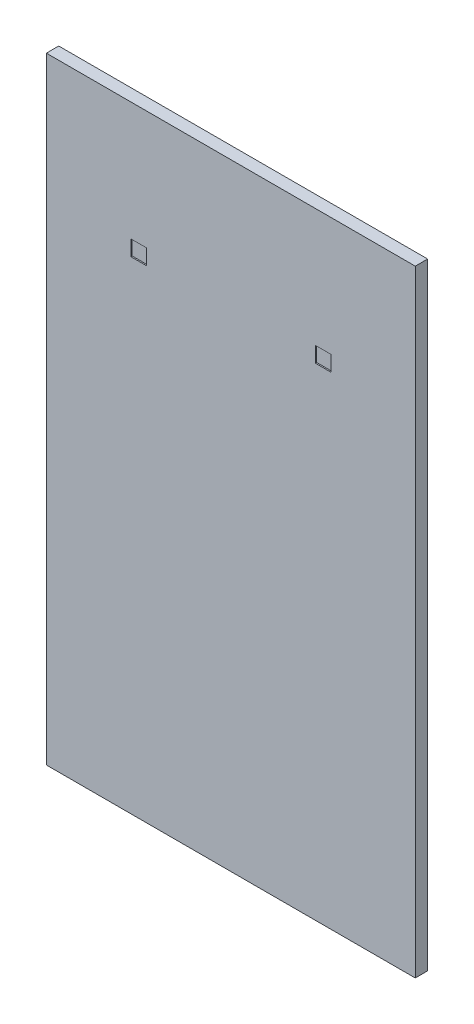
ISO-10303-21;
HEADER;
FILE_DESCRIPTION(('STEP AP214'),'2;1');
FILE_NAME('part.step','',(''),(''),'','','');
FILE_SCHEMA(('AUTOMOTIVE_DESIGN { 1 0 10303 214 1 1 1 1 }'));
ENDSEC;
DATA;
#1=APPLICATION_CONTEXT('core data for automotive mechanical design processes');
#2=APPLICATION_PROTOCOL_DEFINITION('international standard','automotive_design',2000,#1);
#3=PRODUCT_CONTEXT('',#1,'mechanical');
#4=PRODUCT('Part','Part','',(#3));
#5=PRODUCT_RELATED_PRODUCT_CATEGORY('part','',(#4));
#6=PRODUCT_DEFINITION_FORMATION('','',#4);
#7=PRODUCT_DEFINITION_CONTEXT('part definition',#1,'design');
#8=PRODUCT_DEFINITION('design','',#6,#7);
#9=PRODUCT_DEFINITION_SHAPE('','',#8);
#10=(LENGTH_UNIT() NAMED_UNIT(*) SI_UNIT(.MILLI.,.METRE.));
#11=(NAMED_UNIT(*) PLANE_ANGLE_UNIT() SI_UNIT($,.RADIAN.));
#12=(NAMED_UNIT(*) SI_UNIT($,.STERADIAN.) SOLID_ANGLE_UNIT());
#13=UNCERTAINTY_MEASURE_WITH_UNIT(LENGTH_MEASURE(1.E-05),#10,'distance_accuracy_value','');
#14=(GEOMETRIC_REPRESENTATION_CONTEXT(3) GLOBAL_UNCERTAINTY_ASSIGNED_CONTEXT((#13)) GLOBAL_UNIT_ASSIGNED_CONTEXT((#10,
#11,#12)) REPRESENTATION_CONTEXT('',''));
#15=CARTESIAN_POINT('',(0.,0.,0.));
#16=DIRECTION('',(0.,0.,1.));
#17=DIRECTION('',(1.,0.,0.));
#18=AXIS2_PLACEMENT_3D('',#15,#16,#17);
#19=CARTESIAN_POINT('',(-298.,-498.,20.));
#20=DIRECTION('',(1.,0.,0.));
#21=DIRECTION('',(0.,0.,-1.));
#22=AXIS2_PLACEMENT_3D('',#19,#20,#21);
#23=PLANE('',#22);
#24=DIRECTION('',(0.,-1.,0.));
#25=VECTOR('',#24,1.);
#26=CARTESIAN_POINT('',(-298.,-498.,0.));
#27=LINE('',#26,#25);
#28=CARTESIAN_POINT('',(-298.,498.,0.));
#29=VERTEX_POINT('',#28);
#30=CARTESIAN_POINT('',(-298.,-498.,0.));
#31=VERTEX_POINT('',#30);
#32=EDGE_CURVE('E157',#29,#31,#27,.T.);
#33=ORIENTED_EDGE('',*,*,#32,.T.);
#34=DIRECTION('',(0.,0.,-1.));
#35=VECTOR('',#34,1.);
#36=CARTESIAN_POINT('',(-298.,-498.,20.));
#37=LINE('',#36,#35);
#38=CARTESIAN_POINT('',(-298.,-498.,20.));
#39=VERTEX_POINT('',#38);
#40=EDGE_CURVE('E11',#39,#31,#37,.T.);
#41=ORIENTED_EDGE('',*,*,#40,.F.);
#42=DIRECTION('',(0.,-1.,0.));
#43=VECTOR('',#42,1.);
#44=CARTESIAN_POINT('',(-298.,-498.,20.));
#45=LINE('',#44,#43);
#46=CARTESIAN_POINT('',(-298.,498.,20.));
#47=VERTEX_POINT('',#46);
#48=EDGE_CURVE('E190',#47,#39,#45,.T.);
#49=ORIENTED_EDGE('',*,*,#48,.F.);
#50=DIRECTION('',(0.,0.,-1.));
#51=VECTOR('',#50,1.);
#52=CARTESIAN_POINT('',(-298.,498.,20.));
#53=LINE('',#52,#51);
#54=EDGE_CURVE('E200',#47,#29,#53,.T.);
#55=ORIENTED_EDGE('',*,*,#54,.T.);
#56=EDGE_LOOP('',(#33,#41,#49,#55));
#57=FACE_BOUND('',#56,.T.);
#58=ADVANCED_FACE('F33',(#57),#23,.F.);
#59=CARTESIAN_POINT('',(298.,-498.,20.));
#60=DIRECTION('',(0.,1.,0.));
#61=DIRECTION('',(-1.,0.,0.));
#62=AXIS2_PLACEMENT_3D('',#59,#60,#61);
#63=PLANE('',#62);
#64=DIRECTION('',(1.,0.,0.));
#65=VECTOR('',#64,1.);
#66=CARTESIAN_POINT('',(298.,-498.,0.));
#67=LINE('',#66,#65);
#68=CARTESIAN_POINT('',(298.,-498.,0.));
#69=VERTEX_POINT('',#68);
#70=EDGE_CURVE('E203',#31,#69,#67,.T.);
#71=ORIENTED_EDGE('',*,*,#70,.T.);
#72=DIRECTION('',(0.,0.,-1.));
#73=VECTOR('',#72,1.);
#74=CARTESIAN_POINT('',(298.,-498.,20.));
#75=LINE('',#74,#73);
#76=CARTESIAN_POINT('',(298.,-498.,20.));
#77=VERTEX_POINT('',#76);
#78=EDGE_CURVE('E40',#77,#69,#75,.T.);
#79=ORIENTED_EDGE('',*,*,#78,.F.);
#80=DIRECTION('',(1.,0.,0.));
#81=VECTOR('',#80,1.);
#82=CARTESIAN_POINT('',(298.,-498.,20.));
#83=LINE('',#82,#81);
#84=EDGE_CURVE('E193',#39,#77,#83,.T.);
#85=ORIENTED_EDGE('',*,*,#84,.F.);
#86=ORIENTED_EDGE('',*,*,#40,.T.);
#87=EDGE_LOOP('',(#71,#79,#85,#86));
#88=FACE_BOUND('',#87,.T.);
#89=ADVANCED_FACE('F233',(#88),#63,.F.);
#90=CARTESIAN_POINT('',(298.,-498.,20.));
#91=DIRECTION('',(-1.,0.,0.));
#92=DIRECTION('',(0.,0.,1.));
#93=AXIS2_PLACEMENT_3D('',#90,#91,#92);
#94=PLANE('',#93);
#95=DIRECTION('',(0.,1.,0.));
#96=VECTOR('',#95,1.);
#97=CARTESIAN_POINT('',(298.,-498.,0.));
#98=LINE('',#97,#96);
#99=CARTESIAN_POINT('',(298.,498.,0.));
#100=VERTEX_POINT('',#99);
#101=EDGE_CURVE('E205',#69,#100,#98,.T.);
#102=ORIENTED_EDGE('',*,*,#101,.T.);
#103=DIRECTION('',(0.,0.,-1.));
#104=VECTOR('',#103,1.);
#105=CARTESIAN_POINT('',(298.,498.,20.));
#106=LINE('',#105,#104);
#107=CARTESIAN_POINT('',(298.,498.,20.));
#108=VERTEX_POINT('',#107);
#109=EDGE_CURVE('E210',#108,#100,#106,.T.);
#110=ORIENTED_EDGE('',*,*,#109,.F.);
#111=DIRECTION('',(0.,1.,0.));
#112=VECTOR('',#111,1.);
#113=CARTESIAN_POINT('',(298.,-498.,20.));
#114=LINE('',#113,#112);
#115=EDGE_CURVE('E196',#77,#108,#114,.T.);
#116=ORIENTED_EDGE('',*,*,#115,.F.);
#117=ORIENTED_EDGE('',*,*,#78,.T.);
#118=EDGE_LOOP('',(#102,#110,#116,#117));
#119=FACE_BOUND('',#118,.T.);
#120=ADVANCED_FACE('F217',(#119),#94,.F.);
#121=CARTESIAN_POINT('',(298.,498.,20.));
#122=DIRECTION('',(0.,-1.,0.));
#123=DIRECTION('',(1.,0.,0.));
#124=AXIS2_PLACEMENT_3D('',#121,#122,#123);
#125=PLANE('',#124);
#126=DIRECTION('',(-1.,0.,0.));
#127=VECTOR('',#126,1.);
#128=CARTESIAN_POINT('',(298.,498.,0.));
#129=LINE('',#128,#127);
#130=EDGE_CURVE('E194',#100,#29,#129,.T.);
#131=ORIENTED_EDGE('',*,*,#130,.T.);
#132=ORIENTED_EDGE('',*,*,#54,.F.);
#133=DIRECTION('',(-1.,0.,0.));
#134=VECTOR('',#133,1.);
#135=CARTESIAN_POINT('',(298.,498.,20.));
#136=LINE('',#135,#134);
#137=EDGE_CURVE('E198',#108,#47,#136,.T.);
#138=ORIENTED_EDGE('',*,*,#137,.F.);
#139=ORIENTED_EDGE('',*,*,#109,.T.);
#140=EDGE_LOOP('',(#131,#132,#138,#139));
#141=FACE_BOUND('',#140,.T.);
#142=ADVANCED_FACE('F226',(#141),#125,.F.);
#143=CARTESIAN_POINT('',(0.,0.,20.));
#144=DIRECTION('',(0.,0.,1.));
#145=DIRECTION('',(1.,0.,0.));
#146=AXIS2_PLACEMENT_3D('',#143,#144,#145);
#147=PLANE('',#146);
#148=DIRECTION('',(0.,-1.,0.));
#149=VECTOR('',#148,1.);
#150=CARTESIAN_POINT('',(-161.5,281.5,20.));
#151=LINE('',#150,#149);
#152=CARTESIAN_POINT('',(-161.5,306.5,20.));
#153=VERTEX_POINT('',#152);
#154=CARTESIAN_POINT('',(-161.5,281.5,20.));
#155=VERTEX_POINT('',#154);
#156=EDGE_CURVE('E47',#153,#155,#151,.T.);
#157=ORIENTED_EDGE('',*,*,#156,.F.);
#158=DIRECTION('',(-1.,0.,0.));
#159=VECTOR('',#158,1.);
#160=CARTESIAN_POINT('',(-136.5,306.5,20.));
#161=LINE('',#160,#159);
#162=CARTESIAN_POINT('',(-136.5,306.5,20.));
#163=VERTEX_POINT('',#162);
#164=EDGE_CURVE('E141',#163,#153,#161,.T.);
#165=ORIENTED_EDGE('',*,*,#164,.F.);
#166=DIRECTION('',(0.,1.,0.));
#167=VECTOR('',#166,1.);
#168=CARTESIAN_POINT('',(-136.5,281.5,20.));
#169=LINE('',#168,#167);
#170=CARTESIAN_POINT('',(-136.5,281.5,20.));
#171=VERTEX_POINT('',#170);
#172=EDGE_CURVE('E144',#171,#163,#169,.T.);
#173=ORIENTED_EDGE('',*,*,#172,.F.);
#174=DIRECTION('',(1.,0.,0.));
#175=VECTOR('',#174,1.);
#176=CARTESIAN_POINT('',(-136.5,281.5,20.));
#177=LINE('',#176,#175);
#178=EDGE_CURVE('E150',#155,#171,#177,.T.);
#179=ORIENTED_EDGE('',*,*,#178,.F.);
#180=EDGE_LOOP('',(#157,#165,#173,#179));
#181=FACE_BOUND('',#180,.T.);
#182=DIRECTION('',(1.,0.,0.));
#183=VECTOR('',#182,1.);
#184=CARTESIAN_POINT('',(136.5,281.5,20.));
#185=LINE('',#184,#183);
#186=CARTESIAN_POINT('',(136.5,281.5,20.));
#187=VERTEX_POINT('',#186);
#188=CARTESIAN_POINT('',(161.5,281.5,20.));
#189=VERTEX_POINT('',#188);
#190=EDGE_CURVE('E55',#187,#189,#185,.T.);
#191=ORIENTED_EDGE('',*,*,#190,.F.);
#192=DIRECTION('',(0.,-1.,0.));
#193=VECTOR('',#192,1.);
#194=CARTESIAN_POINT('',(136.5,281.5,20.));
#195=LINE('',#194,#193);
#196=CARTESIAN_POINT('',(136.5,306.5,20.));
#197=VERTEX_POINT('',#196);
#198=EDGE_CURVE('E165',#197,#187,#195,.T.);
#199=ORIENTED_EDGE('',*,*,#198,.F.);
#200=DIRECTION('',(-1.,0.,0.));
#201=VECTOR('',#200,1.);
#202=CARTESIAN_POINT('',(136.5,306.5,20.));
#203=LINE('',#202,#201);
#204=CARTESIAN_POINT('',(161.5,306.5,20.));
#205=VERTEX_POINT('',#204);
#206=EDGE_CURVE('E179',#205,#197,#203,.T.);
#207=ORIENTED_EDGE('',*,*,#206,.F.);
#208=DIRECTION('',(0.,1.,0.));
#209=VECTOR('',#208,1.);
#210=CARTESIAN_POINT('',(161.5,281.5,20.));
#211=LINE('',#210,#209);
#212=EDGE_CURVE('E176',#189,#205,#211,.T.);
#213=ORIENTED_EDGE('',*,*,#212,.F.);
#214=EDGE_LOOP('',(#191,#199,#207,#213));
#215=FACE_BOUND('',#214,.T.);
#216=ORIENTED_EDGE('',*,*,#48,.T.);
#217=ORIENTED_EDGE('',*,*,#84,.T.);
#218=ORIENTED_EDGE('',*,*,#115,.T.);
#219=ORIENTED_EDGE('',*,*,#137,.T.);
#220=EDGE_LOOP('',(#216,#217,#218,#219));
#221=FACE_BOUND('',#220,.T.);
#222=ADVANCED_FACE('F232',(#181,#215,#221),#147,.T.);
#223=CARTESIAN_POINT('',(0.,0.,0.));
#224=DIRECTION('',(0.,0.,1.));
#225=DIRECTION('',(1.,0.,0.));
#226=AXIS2_PLACEMENT_3D('',#223,#224,#225);
#227=PLANE('',#226);
#228=ORIENTED_EDGE('',*,*,#32,.F.);
#229=ORIENTED_EDGE('',*,*,#130,.F.);
#230=ORIENTED_EDGE('',*,*,#101,.F.);
#231=ORIENTED_EDGE('',*,*,#70,.F.);
#232=EDGE_LOOP('',(#228,#229,#230,#231));
#233=FACE_BOUND('',#232,.T.);
#234=ADVANCED_FACE('F223',(#233),#227,.F.);
#235=CARTESIAN_POINT('',(136.5,281.5,18.));
#236=DIRECTION('',(0.,-1.,0.));
#237=DIRECTION('',(0.,0.,-1.));
#238=AXIS2_PLACEMENT_3D('',#235,#236,#237);
#239=PLANE('',#238);
#240=ORIENTED_EDGE('',*,*,#190,.T.);
#241=DIRECTION('',(0.,0.,1.));
#242=VECTOR('',#241,1.);
#243=CARTESIAN_POINT('',(161.5,281.5,18.));
#244=LINE('',#243,#242);
#245=CARTESIAN_POINT('',(161.5,281.5,18.));
#246=VERTEX_POINT('',#245);
#247=EDGE_CURVE('E174',#246,#189,#244,.T.);
#248=ORIENTED_EDGE('',*,*,#247,.F.);
#249=DIRECTION('',(1.,0.,0.));
#250=VECTOR('',#249,1.);
#251=CARTESIAN_POINT('',(136.5,281.5,18.));
#252=LINE('',#251,#250);
#253=CARTESIAN_POINT('',(136.5,281.5,18.));
#254=VERTEX_POINT('',#253);
#255=EDGE_CURVE('E161',#254,#246,#252,.T.);
#256=ORIENTED_EDGE('',*,*,#255,.F.);
#257=DIRECTION('',(0.,0.,1.));
#258=VECTOR('',#257,1.);
#259=CARTESIAN_POINT('',(136.5,281.5,18.));
#260=LINE('',#259,#258);
#261=EDGE_CURVE('E151',#254,#187,#260,.T.);
#262=ORIENTED_EDGE('',*,*,#261,.T.);
#263=EDGE_LOOP('',(#240,#248,#256,#262));
#264=FACE_BOUND('',#263,.T.);
#265=ADVANCED_FACE('F245',(#264),#239,.F.);
#266=CARTESIAN_POINT('',(136.5,281.5,18.));
#267=DIRECTION('',(-1.,0.,0.));
#268=DIRECTION('',(0.,0.,1.));
#269=AXIS2_PLACEMENT_3D('',#266,#267,#268);
#270=PLANE('',#269);
#271=ORIENTED_EDGE('',*,*,#198,.T.);
#272=ORIENTED_EDGE('',*,*,#261,.F.);
#273=DIRECTION('',(0.,-1.,0.));
#274=VECTOR('',#273,1.);
#275=CARTESIAN_POINT('',(136.5,281.5,18.));
#276=LINE('',#275,#274);
#277=CARTESIAN_POINT('',(136.5,306.5,18.));
#278=VERTEX_POINT('',#277);
#279=EDGE_CURVE('E171',#278,#254,#276,.T.);
#280=ORIENTED_EDGE('',*,*,#279,.F.);
#281=DIRECTION('',(0.,0.,1.));
#282=VECTOR('',#281,1.);
#283=CARTESIAN_POINT('',(136.5,306.5,18.));
#284=LINE('',#283,#282);
#285=EDGE_CURVE('E185',#278,#197,#284,.T.);
#286=ORIENTED_EDGE('',*,*,#285,.T.);
#287=EDGE_LOOP('',(#271,#272,#280,#286));
#288=FACE_BOUND('',#287,.T.);
#289=ADVANCED_FACE('F251',(#288),#270,.F.);
#290=CARTESIAN_POINT('',(136.5,306.5,18.));
#291=DIRECTION('',(0.,1.,0.));
#292=DIRECTION('',(0.,0.,1.));
#293=AXIS2_PLACEMENT_3D('',#290,#291,#292);
#294=PLANE('',#293);
#295=ORIENTED_EDGE('',*,*,#206,.T.);
#296=ORIENTED_EDGE('',*,*,#285,.F.);
#297=DIRECTION('',(-1.,0.,0.));
#298=VECTOR('',#297,1.);
#299=CARTESIAN_POINT('',(136.5,306.5,18.));
#300=LINE('',#299,#298);
#301=CARTESIAN_POINT('',(161.5,306.5,18.));
#302=VERTEX_POINT('',#301);
#303=EDGE_CURVE('E168',#302,#278,#300,.T.);
#304=ORIENTED_EDGE('',*,*,#303,.F.);
#305=DIRECTION('',(0.,0.,1.));
#306=VECTOR('',#305,1.);
#307=CARTESIAN_POINT('',(161.5,306.5,18.));
#308=LINE('',#307,#306);
#309=EDGE_CURVE('E187',#302,#205,#308,.T.);
#310=ORIENTED_EDGE('',*,*,#309,.T.);
#311=EDGE_LOOP('',(#295,#296,#304,#310));
#312=FACE_BOUND('',#311,.T.);
#313=ADVANCED_FACE('F256',(#312),#294,.F.);
#314=CARTESIAN_POINT('',(161.5,281.5,18.));
#315=DIRECTION('',(1.,0.,0.));
#316=DIRECTION('',(0.,0.,-1.));
#317=AXIS2_PLACEMENT_3D('',#314,#315,#316);
#318=PLANE('',#317);
#319=ORIENTED_EDGE('',*,*,#212,.T.);
#320=ORIENTED_EDGE('',*,*,#309,.F.);
#321=DIRECTION('',(0.,1.,0.));
#322=VECTOR('',#321,1.);
#323=CARTESIAN_POINT('',(161.5,281.5,18.));
#324=LINE('',#323,#322);
#325=EDGE_CURVE('E164',#246,#302,#324,.T.);
#326=ORIENTED_EDGE('',*,*,#325,.F.);
#327=ORIENTED_EDGE('',*,*,#247,.T.);
#328=EDGE_LOOP('',(#319,#320,#326,#327));
#329=FACE_BOUND('',#328,.T.);
#330=ADVANCED_FACE('F252',(#329),#318,.F.);
#331=CARTESIAN_POINT('',(0.,0.,18.));
#332=DIRECTION('',(0.,0.,1.));
#333=DIRECTION('',(1.,0.,0.));
#334=AXIS2_PLACEMENT_3D('',#331,#332,#333);
#335=PLANE('',#334);
#336=ORIENTED_EDGE('',*,*,#255,.T.);
#337=ORIENTED_EDGE('',*,*,#325,.T.);
#338=ORIENTED_EDGE('',*,*,#303,.T.);
#339=ORIENTED_EDGE('',*,*,#279,.T.);
#340=EDGE_LOOP('',(#336,#337,#338,#339));
#341=FACE_BOUND('',#340,.T.);
#342=ADVANCED_FACE('F255',(#341),#335,.T.);
#343=CARTESIAN_POINT('',(-161.5,281.5,18.));
#344=DIRECTION('',(-1.,0.,0.));
#345=DIRECTION('',(0.,0.,1.));
#346=AXIS2_PLACEMENT_3D('',#343,#344,#345);
#347=PLANE('',#346);
#348=ORIENTED_EDGE('',*,*,#156,.T.);
#349=DIRECTION('',(0.,0.,1.));
#350=VECTOR('',#349,1.);
#351=CARTESIAN_POINT('',(-161.5,281.5,18.));
#352=LINE('',#351,#350);
#353=CARTESIAN_POINT('',(-161.5,281.5,18.));
#354=VERTEX_POINT('',#353);
#355=EDGE_CURVE('E119',#354,#155,#352,.T.);
#356=ORIENTED_EDGE('',*,*,#355,.F.);
#357=DIRECTION('',(0.,-1.,0.));
#358=VECTOR('',#357,1.);
#359=CARTESIAN_POINT('',(-161.5,281.5,18.));
#360=LINE('',#359,#358);
#361=CARTESIAN_POINT('',(-161.5,306.5,18.));
#362=VERTEX_POINT('',#361);
#363=EDGE_CURVE('E123',#362,#354,#360,.T.);
#364=ORIENTED_EDGE('',*,*,#363,.F.);
#365=DIRECTION('',(0.,0.,1.));
#366=VECTOR('',#365,1.);
#367=CARTESIAN_POINT('',(-161.5,306.5,18.));
#368=LINE('',#367,#366);
#369=EDGE_CURVE('E155',#362,#153,#368,.T.);
#370=ORIENTED_EDGE('',*,*,#369,.T.);
#371=EDGE_LOOP('',(#348,#356,#364,#370));
#372=FACE_BOUND('',#371,.T.);
#373=ADVANCED_FACE('F121',(#372),#347,.F.);
#374=CARTESIAN_POINT('',(-136.5,306.5,18.));
#375=DIRECTION('',(0.,1.,0.));
#376=DIRECTION('',(0.,0.,1.));
#377=AXIS2_PLACEMENT_3D('',#374,#375,#376);
#378=PLANE('',#377);
#379=ORIENTED_EDGE('',*,*,#164,.T.);
#380=ORIENTED_EDGE('',*,*,#369,.F.);
#381=DIRECTION('',(-1.,0.,0.));
#382=VECTOR('',#381,1.);
#383=CARTESIAN_POINT('',(-136.5,306.5,18.));
#384=LINE('',#383,#382);
#385=CARTESIAN_POINT('',(-136.5,306.5,18.));
#386=VERTEX_POINT('',#385);
#387=EDGE_CURVE('E129',#386,#362,#384,.T.);
#388=ORIENTED_EDGE('',*,*,#387,.F.);
#389=DIRECTION('',(0.,0.,1.));
#390=VECTOR('',#389,1.);
#391=CARTESIAN_POINT('',(-136.5,306.5,18.));
#392=LINE('',#391,#390);
#393=EDGE_CURVE('E158',#386,#163,#392,.T.);
#394=ORIENTED_EDGE('',*,*,#393,.T.);
#395=EDGE_LOOP('',(#379,#380,#388,#394));
#396=FACE_BOUND('',#395,.T.);
#397=ADVANCED_FACE('F269',(#396),#378,.F.);
#398=CARTESIAN_POINT('',(-136.5,281.5,18.));
#399=DIRECTION('',(1.,0.,0.));
#400=DIRECTION('',(0.,0.,-1.));
#401=AXIS2_PLACEMENT_3D('',#398,#399,#400);
#402=PLANE('',#401);
#403=ORIENTED_EDGE('',*,*,#172,.T.);
#404=ORIENTED_EDGE('',*,*,#393,.F.);
#405=DIRECTION('',(0.,1.,0.));
#406=VECTOR('',#405,1.);
#407=CARTESIAN_POINT('',(-136.5,281.5,18.));
#408=LINE('',#407,#406);
#409=CARTESIAN_POINT('',(-136.5,281.5,18.));
#410=VERTEX_POINT('',#409);
#411=EDGE_CURVE('E137',#410,#386,#408,.T.);
#412=ORIENTED_EDGE('',*,*,#411,.F.);
#413=DIRECTION('',(0.,0.,1.));
#414=VECTOR('',#413,1.);
#415=CARTESIAN_POINT('',(-136.5,281.5,18.));
#416=LINE('',#415,#414);
#417=EDGE_CURVE('E128',#410,#171,#416,.T.);
#418=ORIENTED_EDGE('',*,*,#417,.T.);
#419=EDGE_LOOP('',(#403,#404,#412,#418));
#420=FACE_BOUND('',#419,.T.);
#421=ADVANCED_FACE('F272',(#420),#402,.F.);
#422=CARTESIAN_POINT('',(-136.5,281.5,18.));
#423=DIRECTION('',(0.,-1.,0.));
#424=DIRECTION('',(0.,0.,-1.));
#425=AXIS2_PLACEMENT_3D('',#422,#423,#424);
#426=PLANE('',#425);
#427=ORIENTED_EDGE('',*,*,#178,.T.);
#428=ORIENTED_EDGE('',*,*,#417,.F.);
#429=DIRECTION('',(1.,0.,0.));
#430=VECTOR('',#429,1.);
#431=CARTESIAN_POINT('',(-136.5,281.5,18.));
#432=LINE('',#431,#430);
#433=EDGE_CURVE('E132',#354,#410,#432,.T.);
#434=ORIENTED_EDGE('',*,*,#433,.F.);
#435=ORIENTED_EDGE('',*,*,#355,.T.);
#436=EDGE_LOOP('',(#427,#428,#434,#435));
#437=FACE_BOUND('',#436,.T.);
#438=ADVANCED_FACE('F133',(#437),#426,.F.);
#439=CARTESIAN_POINT('',(0.,0.,18.));
#440=DIRECTION('',(0.,0.,1.));
#441=DIRECTION('',(1.,0.,0.));
#442=AXIS2_PLACEMENT_3D('',#439,#440,#441);
#443=PLANE('',#442);
#444=ORIENTED_EDGE('',*,*,#363,.T.);
#445=ORIENTED_EDGE('',*,*,#433,.T.);
#446=ORIENTED_EDGE('',*,*,#411,.T.);
#447=ORIENTED_EDGE('',*,*,#387,.T.);
#448=EDGE_LOOP('',(#444,#445,#446,#447));
#449=FACE_BOUND('',#448,.T.);
#450=ADVANCED_FACE('F139',(#449),#443,.T.);
#451=CLOSED_SHELL('',(#58,#89,#120,#142,#222,#234,#265,#289,#313,#330,#342,#373,#397,#421,#438,#450));
#452=MANIFOLD_SOLID_BREP('B2',#451);
#453=ADVANCED_BREP_SHAPE_REPRESENTATION('',(#18,#452),#14);
#454=SHAPE_DEFINITION_REPRESENTATION(#9,#453);
ENDSEC;
END-ISO-10303-21;
